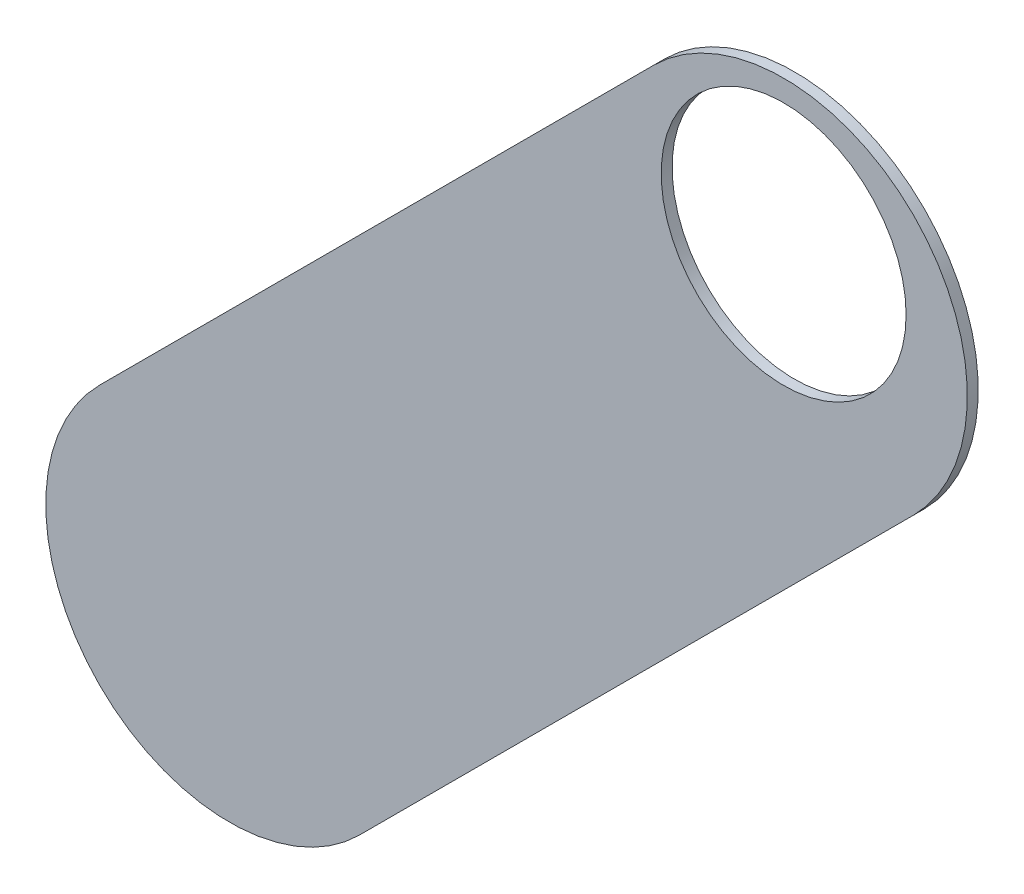
ISO-10303-21;
HEADER;
FILE_DESCRIPTION(('STEP AP214'),'2;1');
FILE_NAME('part.step','',(''),(''),'','','');
FILE_SCHEMA(('AUTOMOTIVE_DESIGN { 1 0 10303 214 1 1 1 1 }'));
ENDSEC;
DATA;
#1=APPLICATION_CONTEXT('core data for automotive mechanical design processes');
#2=APPLICATION_PROTOCOL_DEFINITION('international standard','automotive_design',2000,#1);
#3=PRODUCT_CONTEXT('',#1,'mechanical');
#4=PRODUCT('Part','Part','',(#3));
#5=PRODUCT_RELATED_PRODUCT_CATEGORY('part','',(#4));
#6=PRODUCT_DEFINITION_FORMATION('','',#4);
#7=PRODUCT_DEFINITION_CONTEXT('part definition',#1,'design');
#8=PRODUCT_DEFINITION('design','',#6,#7);
#9=PRODUCT_DEFINITION_SHAPE('','',#8);
#10=(LENGTH_UNIT() NAMED_UNIT(*) SI_UNIT(.MILLI.,.METRE.));
#11=(NAMED_UNIT(*) PLANE_ANGLE_UNIT() SI_UNIT($,.RADIAN.));
#12=(NAMED_UNIT(*) SI_UNIT($,.STERADIAN.) SOLID_ANGLE_UNIT());
#13=UNCERTAINTY_MEASURE_WITH_UNIT(LENGTH_MEASURE(1.E-05),#10,'distance_accuracy_value','');
#14=(GEOMETRIC_REPRESENTATION_CONTEXT(3) GLOBAL_UNCERTAINTY_ASSIGNED_CONTEXT((#13)) GLOBAL_UNIT_ASSIGNED_CONTEXT((#10,
#11,#12)) REPRESENTATION_CONTEXT('',''));
#15=CARTESIAN_POINT('',(0.,0.,0.));
#16=DIRECTION('',(0.,0.,1.));
#17=DIRECTION('',(1.,0.,0.));
#18=AXIS2_PLACEMENT_3D('',#15,#16,#17);
#19=CARTESIAN_POINT('',(84.32426366,104.4455366,0.));
#20=DIRECTION('',(-0.707106781186548,0.707106781186548,0.));
#21=DIRECTION('',(0.707106781186548,0.707106781186548,0.));
#22=AXIS2_PLACEMENT_3D('',#19,#20,#21);
#23=PLANE('',#22);
#24=DIRECTION('',(0.707106781186548,0.707106781186548,0.));
#25=VECTOR('',#24,1.);
#26=CARTESIAN_POINT('',(84.32426366,104.4455366,0.03556));
#27=LINE('',#26,#25);
#28=CARTESIAN_POINT('',(84.32426366,104.4455366,0.03556));
#29=VERTEX_POINT('',#28);
#30=CARTESIAN_POINT('',(86.13427782,106.25555076,0.03556));
#31=VERTEX_POINT('',#30);
#32=EDGE_CURVE('E11',#29,#31,#27,.T.);
#33=ORIENTED_EDGE('',*,*,#32,.F.);
#34=DIRECTION('',(0.,0.,1.));
#35=VECTOR('',#34,1.);
#36=CARTESIAN_POINT('',(84.32426366,104.4455366,0.));
#37=LINE('',#36,#35);
#38=CARTESIAN_POINT('',(84.32426366,104.4455366,0.));
#39=VERTEX_POINT('',#38);
#40=EDGE_CURVE('E24',#39,#29,#37,.T.);
#41=ORIENTED_EDGE('',*,*,#40,.F.);
#42=DIRECTION('',(0.707106781186548,0.707106781186548,0.));
#43=VECTOR('',#42,1.);
#44=CARTESIAN_POINT('',(84.32426366,104.4455366,0.));
#45=LINE('',#44,#43);
#46=CARTESIAN_POINT('',(86.13427782,106.25555076,0.));
#47=VERTEX_POINT('',#46);
#48=EDGE_CURVE('E96',#39,#47,#45,.T.);
#49=ORIENTED_EDGE('',*,*,#48,.T.);
#50=DIRECTION('',(0.,0.,1.));
#51=VECTOR('',#50,1.);
#52=CARTESIAN_POINT('',(86.13427782,106.25555076,0.));
#53=LINE('',#52,#51);
#54=EDGE_CURVE('E37',#47,#31,#53,.T.);
#55=ORIENTED_EDGE('',*,*,#54,.T.);
#56=EDGE_LOOP('',(#33,#41,#49,#55));
#57=FACE_BOUND('',#56,.T.);
#58=ADVANCED_FACE('F17',(#57),#23,.F.);
#59=CARTESIAN_POINT('',(83.89999984,104.86980042,0.));
#60=DIRECTION('',(0.,0.,-1.));
#61=DIRECTION('',(-0.707106781186536,0.707106781186559,0.));
#62=AXIS2_PLACEMENT_3D('',#59,#60,#61);
#63=CYLINDRICAL_SURFACE('',#62,0.599999648268215);
#64=CARTESIAN_POINT('',(83.89999984,104.86980042,0.03556));
#65=DIRECTION('',(0.,0.,1.));
#66=DIRECTION('',(-0.707106781186536,0.707106781186559,0.));
#67=AXIS2_PLACEMENT_3D('',#64,#65,#66);
#68=CIRCLE('',#67,0.599999648268215);
#69=CARTESIAN_POINT('',(83.47573602,105.29406424,0.03556));
#70=VERTEX_POINT('',#69);
#71=EDGE_CURVE('E92',#70,#29,#68,.T.);
#72=ORIENTED_EDGE('',*,*,#71,.F.);
#73=DIRECTION('',(0.,0.,1.));
#74=VECTOR('',#73,1.);
#75=CARTESIAN_POINT('',(83.47573602,105.29406424,0.));
#76=LINE('',#75,#74);
#77=CARTESIAN_POINT('',(83.47573602,105.29406424,0.));
#78=VERTEX_POINT('',#77);
#79=EDGE_CURVE('E90',#78,#70,#76,.T.);
#80=ORIENTED_EDGE('',*,*,#79,.F.);
#81=CARTESIAN_POINT('',(83.89999984,104.86980042,0.));
#82=DIRECTION('',(0.,0.,1.));
#83=DIRECTION('',(-0.707106781186536,0.707106781186559,0.));
#84=AXIS2_PLACEMENT_3D('',#81,#82,#83);
#85=CIRCLE('',#84,0.599999648268215);
#86=EDGE_CURVE('E88',#78,#39,#85,.T.);
#87=ORIENTED_EDGE('',*,*,#86,.T.);
#88=ORIENTED_EDGE('',*,*,#40,.T.);
#89=EDGE_LOOP('',(#72,#80,#87,#88));
#90=FACE_BOUND('',#89,.T.);
#91=ADVANCED_FACE('F111',(#90),#63,.T.);
#92=CARTESIAN_POINT('',(85.710014,106.67981458,0.));
#93=DIRECTION('',(0.,0.,-1.));
#94=DIRECTION('',(0.707106781186536,-0.707106781186559,0.));
#95=AXIS2_PLACEMENT_3D('',#92,#93,#94);
#96=CYLINDRICAL_SURFACE('',#95,0.599999648268215);
#97=CARTESIAN_POINT('',(85.710014,106.67981458,0.03556));
#98=DIRECTION('',(0.,0.,1.));
#99=DIRECTION('',(0.707106781186536,-0.707106781186559,0.));
#100=AXIS2_PLACEMENT_3D('',#97,#98,#99);
#101=CIRCLE('',#100,0.599999648268215);
#102=CARTESIAN_POINT('',(85.28575018,107.1040784,0.03556));
#103=VERTEX_POINT('',#102);
#104=EDGE_CURVE('E85',#31,#103,#101,.T.);
#105=ORIENTED_EDGE('',*,*,#104,.F.);
#106=ORIENTED_EDGE('',*,*,#54,.F.);
#107=CARTESIAN_POINT('',(85.710014,106.67981458,0.));
#108=DIRECTION('',(0.,0.,1.));
#109=DIRECTION('',(0.707106781186536,-0.707106781186559,0.));
#110=AXIS2_PLACEMENT_3D('',#107,#108,#109);
#111=CIRCLE('',#110,0.599999648268215);
#112=CARTESIAN_POINT('',(85.28575018,107.1040784,0.));
#113=VERTEX_POINT('',#112);
#114=EDGE_CURVE('E82',#47,#113,#111,.T.);
#115=ORIENTED_EDGE('',*,*,#114,.T.);
#116=DIRECTION('',(0.,0.,1.));
#117=VECTOR('',#116,1.);
#118=CARTESIAN_POINT('',(85.28575018,107.1040784,0.));
#119=LINE('',#118,#117);
#120=EDGE_CURVE('E80',#113,#103,#119,.T.);
#121=ORIENTED_EDGE('',*,*,#120,.T.);
#122=EDGE_LOOP('',(#105,#106,#115,#121));
#123=FACE_BOUND('',#122,.T.);
#124=ADVANCED_FACE('F104',(#123),#96,.T.);
#125=CARTESIAN_POINT('',(85.28575018,107.1040784,0.));
#126=DIRECTION('',(0.707106781186548,-0.707106781186548,0.));
#127=DIRECTION('',(-0.707106781186548,-0.707106781186548,0.));
#128=AXIS2_PLACEMENT_3D('',#125,#126,#127);
#129=PLANE('',#128);
#130=DIRECTION('',(-0.707106781186548,-0.707106781186548,0.));
#131=VECTOR('',#130,1.);
#132=CARTESIAN_POINT('',(85.28575018,107.1040784,0.03556));
#133=LINE('',#132,#131);
#134=EDGE_CURVE('E77',#103,#70,#133,.T.);
#135=ORIENTED_EDGE('',*,*,#134,.F.);
#136=ORIENTED_EDGE('',*,*,#120,.F.);
#137=DIRECTION('',(-0.707106781186548,-0.707106781186548,0.));
#138=VECTOR('',#137,1.);
#139=CARTESIAN_POINT('',(85.28575018,107.1040784,0.));
#140=LINE('',#139,#138);
#141=EDGE_CURVE('E68',#113,#78,#140,.T.);
#142=ORIENTED_EDGE('',*,*,#141,.T.);
#143=ORIENTED_EDGE('',*,*,#79,.T.);
#144=EDGE_LOOP('',(#135,#136,#142,#143));
#145=FACE_BOUND('',#144,.T.);
#146=ADVANCED_FACE('F110',(#145),#129,.F.);
#147=CARTESIAN_POINT('',(85.710014,106.8099972,0.));
#148=DIRECTION('',(0.,0.,-1.));
#149=DIRECTION('',(1.,0.,0.));
#150=AXIS2_PLACEMENT_3D('',#147,#148,#149);
#151=CYLINDRICAL_SURFACE('',#150,0.3999992);
#152=DIRECTION('',(0.,0.,1.));
#153=VECTOR('',#152,1.);
#154=CARTESIAN_POINT('',(86.1100132,106.8099972,0.));
#155=LINE('',#154,#153);
#156=CARTESIAN_POINT('',(86.1100132,106.8099972,0.));
#157=VERTEX_POINT('',#156);
#158=CARTESIAN_POINT('',(86.1100132,106.8099972,0.03556));
#159=VERTEX_POINT('',#158);
#160=EDGE_CURVE('E62',#157,#159,#155,.T.);
#161=ORIENTED_EDGE('',*,*,#160,.T.);
#162=CARTESIAN_POINT('',(85.710014,106.8099972,0.03556));
#163=DIRECTION('',(0.,0.,1.));
#164=DIRECTION('',(1.,0.,0.));
#165=AXIS2_PLACEMENT_3D('',#162,#163,#164);
#166=CIRCLE('',#165,0.3999992);
#167=EDGE_CURVE('E67',#159,#159,#166,.T.);
#168=ORIENTED_EDGE('',*,*,#167,.T.);
#169=ORIENTED_EDGE('',*,*,#160,.F.);
#170=CARTESIAN_POINT('',(85.710014,106.8099972,0.));
#171=DIRECTION('',(0.,0.,1.));
#172=DIRECTION('',(1.,0.,0.));
#173=AXIS2_PLACEMENT_3D('',#170,#171,#172);
#174=CIRCLE('',#173,0.3999992);
#175=EDGE_CURVE('E65',#157,#157,#174,.T.);
#176=ORIENTED_EDGE('',*,*,#175,.F.);
#177=EDGE_LOOP('',(#161,#168,#169,#176));
#178=FACE_BOUND('',#177,.T.);
#179=ADVANCED_FACE('F64',(#178),#151,.F.);
#180=CARTESIAN_POINT('',(84.32426366,104.4455366,0.));
#181=DIRECTION('',(0.,0.,-1.));
#182=DIRECTION('',(-1.,0.,0.));
#183=AXIS2_PLACEMENT_3D('',#180,#181,#182);
#184=PLANE('',#183);
#185=ORIENTED_EDGE('',*,*,#48,.F.);
#186=ORIENTED_EDGE('',*,*,#86,.F.);
#187=ORIENTED_EDGE('',*,*,#141,.F.);
#188=ORIENTED_EDGE('',*,*,#114,.F.);
#189=EDGE_LOOP('',(#185,#186,#187,#188));
#190=FACE_BOUND('',#189,.T.);
#191=ORIENTED_EDGE('',*,*,#175,.T.);
#192=EDGE_LOOP('',(#191));
#193=FACE_BOUND('',#192,.T.);
#194=ADVANCED_FACE('F71',(#190,#193),#184,.T.);
#195=CARTESIAN_POINT('',(84.32426366,104.4455366,0.03556));
#196=DIRECTION('',(0.,0.,-1.));
#197=DIRECTION('',(-1.,0.,0.));
#198=AXIS2_PLACEMENT_3D('',#195,#196,#197);
#199=PLANE('',#198);
#200=ORIENTED_EDGE('',*,*,#134,.T.);
#201=ORIENTED_EDGE('',*,*,#71,.T.);
#202=ORIENTED_EDGE('',*,*,#32,.T.);
#203=ORIENTED_EDGE('',*,*,#104,.T.);
#204=EDGE_LOOP('',(#200,#201,#202,#203));
#205=FACE_BOUND('',#204,.T.);
#206=ORIENTED_EDGE('',*,*,#167,.F.);
#207=EDGE_LOOP('',(#206));
#208=FACE_BOUND('',#207,.T.);
#209=ADVANCED_FACE('F107',(#205,#208),#199,.F.);
#210=CLOSED_SHELL('',(#58,#91,#124,#146,#179,#194,#209));
#211=MANIFOLD_SOLID_BREP('B1',#210);
#212=ADVANCED_BREP_SHAPE_REPRESENTATION('',(#18,#211),#14);
#213=SHAPE_DEFINITION_REPRESENTATION(#9,#212);
ENDSEC;
END-ISO-10303-21;
